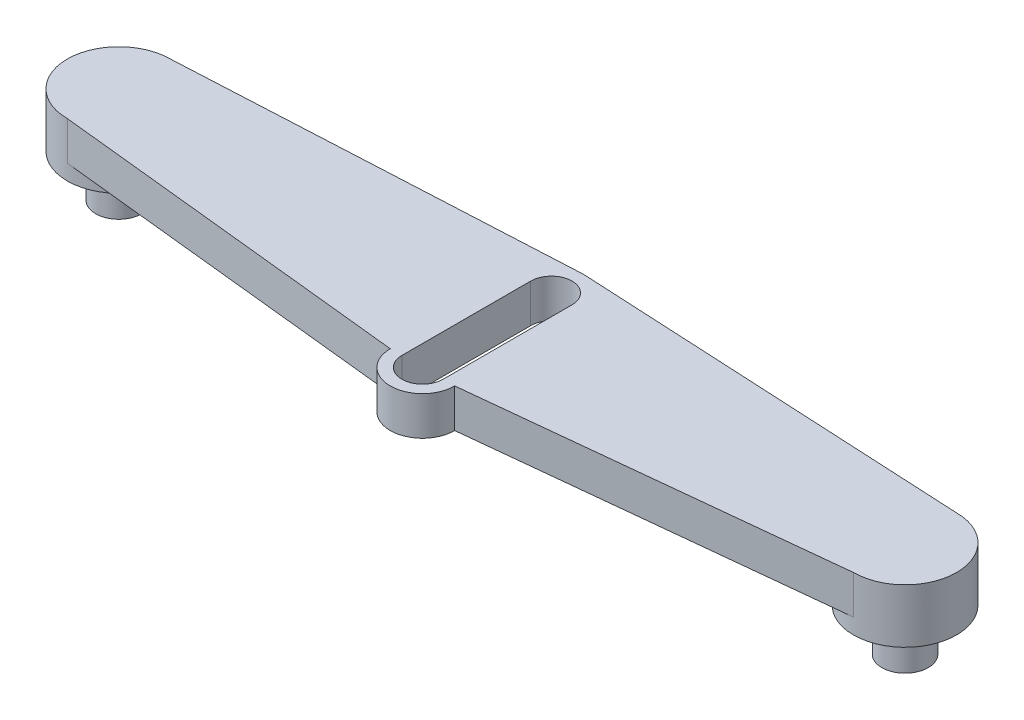
ISO-10303-21;
HEADER;
FILE_DESCRIPTION(('STEP AP214'),'2;1');
FILE_NAME('part.step','',(''),(''),'','','');
FILE_SCHEMA(('AUTOMOTIVE_DESIGN { 1 0 10303 214 1 1 1 1 }'));
ENDSEC;
DATA;
#1=APPLICATION_CONTEXT('core data for automotive mechanical design processes');
#2=APPLICATION_PROTOCOL_DEFINITION('international standard','automotive_design',2000,#1);
#3=PRODUCT_CONTEXT('',#1,'mechanical');
#4=PRODUCT('Part','Part','',(#3));
#5=PRODUCT_RELATED_PRODUCT_CATEGORY('part','',(#4));
#6=PRODUCT_DEFINITION_FORMATION('','',#4);
#7=PRODUCT_DEFINITION_CONTEXT('part definition',#1,'design');
#8=PRODUCT_DEFINITION('design','',#6,#7);
#9=PRODUCT_DEFINITION_SHAPE('','',#8);
#10=(LENGTH_UNIT() NAMED_UNIT(*) SI_UNIT(.MILLI.,.METRE.));
#11=(NAMED_UNIT(*) PLANE_ANGLE_UNIT() SI_UNIT($,.RADIAN.));
#12=(NAMED_UNIT(*) SI_UNIT($,.STERADIAN.) SOLID_ANGLE_UNIT());
#13=UNCERTAINTY_MEASURE_WITH_UNIT(LENGTH_MEASURE(1.E-05),#10,'distance_accuracy_value','');
#14=(GEOMETRIC_REPRESENTATION_CONTEXT(3) GLOBAL_UNCERTAINTY_ASSIGNED_CONTEXT((#13)) GLOBAL_UNIT_ASSIGNED_CONTEXT((#10,
#11,#12)) REPRESENTATION_CONTEXT('',''));
#15=CARTESIAN_POINT('',(0.,0.,0.));
#16=DIRECTION('',(0.,0.,1.));
#17=DIRECTION('',(1.,0.,0.));
#18=AXIS2_PLACEMENT_3D('',#15,#16,#17);
#19=CARTESIAN_POINT('',(0.,0.,0.));
#20=DIRECTION('',(0.,1.,0.));
#21=DIRECTION('',(0.,0.,1.));
#22=AXIS2_PLACEMENT_3D('',#19,#20,#21);
#23=PLANE('',#22);
#24=CARTESIAN_POINT('',(6.29937173741402,0.,11.8964997718201));
#25=DIRECTION('',(0.,1.,0.));
#26=DIRECTION('',(0.,0.,1.));
#27=AXIS2_PLACEMENT_3D('',#24,#25,#26);
#28=CIRCLE('',#27,1.79999999999999);
#29=CARTESIAN_POINT('',(6.29937173741402,0.,13.6964997718201));
#30=VERTEX_POINT('',#29);
#31=EDGE_CURVE('E348',#30,#30,#28,.T.);
#32=ORIENTED_EDGE('',*,*,#31,.T.);
#33=EDGE_LOOP('',(#32));
#34=FACE_BOUND('',#33,.T.);
#35=CARTESIAN_POINT('',(6.29937173741402,0.,11.8964997718201));
#36=DIRECTION('',(0.,1.,0.));
#37=DIRECTION('',(0.,0.,1.));
#38=AXIS2_PLACEMENT_3D('',#35,#36,#37);
#39=CIRCLE('',#38,1.99999999999999);
#40=CARTESIAN_POINT('',(6.29937173741402,0.,13.8964997718201));
#41=VERTEX_POINT('',#40);
#42=EDGE_CURVE('E198',#41,#41,#39,.T.);
#43=ORIENTED_EDGE('',*,*,#42,.F.);
#44=EDGE_LOOP('',(#43));
#45=FACE_BOUND('',#44,.T.);
#46=ADVANCED_FACE('F59',(#34,#45),#23,.F.);
#47=CARTESIAN_POINT('',(6.29937173741402,-4.5,11.8964997718201));
#48=DIRECTION('',(0.,1.,0.));
#49=DIRECTION('',(0.,0.,1.));
#50=AXIS2_PLACEMENT_3D('',#47,#48,#49);
#51=CYLINDRICAL_SURFACE('',#50,1.79999999999999);
#52=CARTESIAN_POINT('',(6.29937173741402,-4.5,11.8964997718201));
#53=DIRECTION('',(0.,1.,0.));
#54=DIRECTION('',(0.,0.,1.));
#55=AXIS2_PLACEMENT_3D('',#52,#53,#54);
#56=CIRCLE('',#55,1.79999999999999);
#57=CARTESIAN_POINT('',(6.29937173741402,-4.5,13.6964997718201));
#58=VERTEX_POINT('',#57);
#59=EDGE_CURVE('E217',#58,#58,#56,.T.);
#60=ORIENTED_EDGE('',*,*,#59,.T.);
#61=EDGE_LOOP('',(#60));
#62=FACE_BOUND('',#61,.T.);
#63=ORIENTED_EDGE('',*,*,#31,.F.);
#64=EDGE_LOOP('',(#63));
#65=FACE_BOUND('',#64,.T.);
#66=ADVANCED_FACE('F264',(#62,#65),#51,.T.);
#67=CARTESIAN_POINT('',(0.,-4.5,0.));
#68=DIRECTION('',(0.,1.,0.));
#69=DIRECTION('',(0.,0.,1.));
#70=AXIS2_PLACEMENT_3D('',#67,#68,#69);
#71=PLANE('',#70);
#72=ORIENTED_EDGE('',*,*,#59,.F.);
#73=EDGE_LOOP('',(#72));
#74=FACE_BOUND('',#73,.T.);
#75=ADVANCED_FACE('F270',(#74),#71,.F.);
#76=CARTESIAN_POINT('',(6.29937173741402,-1.2,11.8964997718201));
#77=DIRECTION('',(0.,1.,0.));
#78=DIRECTION('',(0.,0.,1.));
#79=AXIS2_PLACEMENT_3D('',#76,#77,#78);
#80=CYLINDRICAL_SURFACE('',#79,1.99999999999999);
#81=CARTESIAN_POINT('',(6.29937173741402,-1.2,11.8964997718201));
#82=DIRECTION('',(0.,1.,0.));
#83=DIRECTION('',(0.,0.,1.));
#84=AXIS2_PLACEMENT_3D('',#81,#82,#83);
#85=CIRCLE('',#84,1.99999999999999);
#86=CARTESIAN_POINT('',(6.29937173741402,-1.2,13.8964997718201));
#87=VERTEX_POINT('',#86);
#88=EDGE_CURVE('E335',#87,#87,#85,.T.);
#89=ORIENTED_EDGE('',*,*,#88,.F.);
#90=EDGE_LOOP('',(#89));
#91=FACE_BOUND('',#90,.T.);
#92=ORIENTED_EDGE('',*,*,#42,.T.);
#93=EDGE_LOOP('',(#92));
#94=FACE_BOUND('',#93,.T.);
#95=ADVANCED_FACE('F309',(#91,#94),#80,.F.);
#96=CARTESIAN_POINT('',(0.,-1.2,0.));
#97=DIRECTION('',(0.,1.,0.));
#98=DIRECTION('',(0.,0.,1.));
#99=AXIS2_PLACEMENT_3D('',#96,#97,#98);
#100=PLANE('',#99);
#101=ORIENTED_EDGE('',*,*,#88,.T.);
#102=EDGE_LOOP('',(#101));
#103=FACE_BOUND('',#102,.T.);
#104=CARTESIAN_POINT('',(6.29937173741402,-1.2,11.8964997718201));
#105=DIRECTION('',(0.,1.,0.));
#106=DIRECTION('',(0.,0.,1.));
#107=AXIS2_PLACEMENT_3D('',#104,#105,#106);
#108=CIRCLE('',#107,3.99867945611847);
#109=CARTESIAN_POINT('',(6.29937173741402,-1.2,15.8951792279385));
#110=VERTEX_POINT('',#109);
#111=EDGE_CURVE('E333',#110,#110,#108,.T.);
#112=ORIENTED_EDGE('',*,*,#111,.F.);
#113=EDGE_LOOP('',(#112));
#114=FACE_BOUND('',#113,.T.);
#115=ADVANCED_FACE('F306',(#103,#114),#100,.F.);
#116=CARTESIAN_POINT('',(38.399371737414,3.,0.));
#117=DIRECTION('',(-1.,0.,0.));
#118=DIRECTION('',(0.,0.,1.));
#119=AXIS2_PLACEMENT_3D('',#116,#117,#118);
#120=PLANE('',#119);
#121=DIRECTION('',(0.,0.,-1.));
#122=VECTOR('',#121,1.);
#123=CARTESIAN_POINT('',(38.399371737414,0.,0.));
#124=LINE('',#123,#122);
#125=CARTESIAN_POINT('',(38.399371737414,0.,18.8349533843524));
#126=VERTEX_POINT('',#125);
#127=CARTESIAN_POINT('',(38.399371737414,0.,8.8349533843524));
#128=VERTEX_POINT('',#127);
#129=EDGE_CURVE('E155',#126,#128,#124,.T.);
#130=ORIENTED_EDGE('',*,*,#129,.F.);
#131=DIRECTION('',(0.,-1.,0.));
#132=VECTOR('',#131,1.);
#133=CARTESIAN_POINT('',(38.399371737414,3.,18.8349533843524));
#134=LINE('',#133,#132);
#135=CARTESIAN_POINT('',(38.399371737414,3.,18.8349533843524));
#136=VERTEX_POINT('',#135);
#137=EDGE_CURVE('E150',#136,#126,#134,.T.);
#138=ORIENTED_EDGE('',*,*,#137,.F.);
#139=DIRECTION('',(0.,0.,-1.));
#140=VECTOR('',#139,1.);
#141=CARTESIAN_POINT('',(38.399371737414,3.,0.));
#142=LINE('',#141,#140);
#143=CARTESIAN_POINT('',(38.399371737414,3.,8.8349533843524));
#144=VERTEX_POINT('',#143);
#145=EDGE_CURVE('E153',#136,#144,#142,.T.);
#146=ORIENTED_EDGE('',*,*,#145,.T.);
#147=DIRECTION('',(0.,-1.,0.));
#148=VECTOR('',#147,1.);
#149=CARTESIAN_POINT('',(38.399371737414,3.,8.8349533843524));
#150=LINE('',#149,#148);
#151=EDGE_CURVE('E160',#144,#128,#150,.T.);
#152=ORIENTED_EDGE('',*,*,#151,.T.);
#153=EDGE_LOOP('',(#130,#138,#146,#152));
#154=FACE_BOUND('',#153,.T.);
#155=ADVANCED_FACE('F152',(#154),#120,.T.);
#156=CARTESIAN_POINT('',(36.799371737414,3.,18.8349533843524));
#157=DIRECTION('',(0.,-1.,0.));
#158=DIRECTION('',(0.,0.,-1.));
#159=AXIS2_PLACEMENT_3D('',#156,#157,#158);
#160=CYLINDRICAL_SURFACE('',#159,1.6);
#161=CARTESIAN_POINT('',(36.799371737414,0.,18.8349533843524));
#162=DIRECTION('',(0.,1.,0.));
#163=DIRECTION('',(0.,0.,1.));
#164=AXIS2_PLACEMENT_3D('',#161,#162,#163);
#165=CIRCLE('',#164,1.6);
#166=CARTESIAN_POINT('',(35.199371737414,0.,18.8349533843524));
#167=VERTEX_POINT('',#166);
#168=EDGE_CURVE('E190',#167,#126,#165,.T.);
#169=ORIENTED_EDGE('',*,*,#168,.F.);
#170=DIRECTION('',(0.,-1.,0.));
#171=VECTOR('',#170,1.);
#172=CARTESIAN_POINT('',(35.199371737414,3.,18.8349533843524));
#173=LINE('',#172,#171);
#174=CARTESIAN_POINT('',(35.199371737414,3.,18.8349533843524));
#175=VERTEX_POINT('',#174);
#176=EDGE_CURVE('E108',#175,#167,#173,.T.);
#177=ORIENTED_EDGE('',*,*,#176,.F.);
#178=CARTESIAN_POINT('',(36.799371737414,3.,18.8349533843524));
#179=DIRECTION('',(0.,1.,0.));
#180=DIRECTION('',(0.,0.,1.));
#181=AXIS2_PLACEMENT_3D('',#178,#179,#180);
#182=CIRCLE('',#181,1.6);
#183=EDGE_CURVE('E163',#175,#136,#182,.T.);
#184=ORIENTED_EDGE('',*,*,#183,.T.);
#185=ORIENTED_EDGE('',*,*,#137,.T.);
#186=EDGE_LOOP('',(#169,#177,#184,#185));
#187=FACE_BOUND('',#186,.T.);
#188=ADVANCED_FACE('F166',(#187),#160,.F.);
#189=CARTESIAN_POINT('',(35.199371737414,3.,0.));
#190=DIRECTION('',(-1.,0.,0.));
#191=DIRECTION('',(0.,0.,1.));
#192=AXIS2_PLACEMENT_3D('',#189,#190,#191);
#193=PLANE('',#192);
#194=DIRECTION('',(0.,0.,-1.));
#195=VECTOR('',#194,1.);
#196=CARTESIAN_POINT('',(35.199371737414,0.,0.));
#197=LINE('',#196,#195);
#198=CARTESIAN_POINT('',(35.199371737414,0.,8.8349533843524));
#199=VERTEX_POINT('',#198);
#200=EDGE_CURVE('E192',#167,#199,#197,.T.);
#201=ORIENTED_EDGE('',*,*,#200,.T.);
#202=DIRECTION('',(0.,-1.,0.));
#203=VECTOR('',#202,1.);
#204=CARTESIAN_POINT('',(35.199371737414,3.,8.8349533843524));
#205=LINE('',#204,#203);
#206=CARTESIAN_POINT('',(35.199371737414,3.,8.8349533843524));
#207=VERTEX_POINT('',#206);
#208=EDGE_CURVE('E115',#207,#199,#205,.T.);
#209=ORIENTED_EDGE('',*,*,#208,.F.);
#210=DIRECTION('',(0.,0.,-1.));
#211=VECTOR('',#210,1.);
#212=CARTESIAN_POINT('',(35.199371737414,3.,0.));
#213=LINE('',#212,#211);
#214=EDGE_CURVE('E76',#175,#207,#213,.T.);
#215=ORIENTED_EDGE('',*,*,#214,.F.);
#216=ORIENTED_EDGE('',*,*,#176,.T.);
#217=EDGE_LOOP('',(#201,#209,#215,#216));
#218=FACE_BOUND('',#217,.T.);
#219=ADVANCED_FACE('F252',(#218),#193,.F.);
#220=CARTESIAN_POINT('',(36.799371737414,3.,8.8349533843524));
#221=DIRECTION('',(0.,-1.,0.));
#222=DIRECTION('',(0.,0.,-1.));
#223=AXIS2_PLACEMENT_3D('',#220,#221,#222);
#224=CYLINDRICAL_SURFACE('',#223,1.6);
#225=CARTESIAN_POINT('',(36.799371737414,0.,8.8349533843524));
#226=DIRECTION('',(0.,1.,0.));
#227=DIRECTION('',(0.,0.,1.));
#228=AXIS2_PLACEMENT_3D('',#225,#226,#227);
#229=CIRCLE('',#228,1.6);
#230=EDGE_CURVE('E186',#128,#199,#229,.T.);
#231=ORIENTED_EDGE('',*,*,#230,.F.);
#232=ORIENTED_EDGE('',*,*,#151,.F.);
#233=CARTESIAN_POINT('',(36.799371737414,3.,8.8349533843524));
#234=DIRECTION('',(0.,1.,0.));
#235=DIRECTION('',(0.,0.,1.));
#236=AXIS2_PLACEMENT_3D('',#233,#234,#235);
#237=CIRCLE('',#236,1.6);
#238=EDGE_CURVE('E164',#144,#207,#237,.T.);
#239=ORIENTED_EDGE('',*,*,#238,.T.);
#240=ORIENTED_EDGE('',*,*,#208,.T.);
#241=EDGE_LOOP('',(#231,#232,#239,#240));
#242=FACE_BOUND('',#241,.T.);
#243=ADVANCED_FACE('F251',(#242),#224,.F.);
#244=CARTESIAN_POINT('',(36.799371737414,3.,18.8349533843524));
#245=DIRECTION('',(0.,-1.,0.));
#246=DIRECTION('',(0.,0.,-1.));
#247=AXIS2_PLACEMENT_3D('',#244,#245,#246);
#248=CYLINDRICAL_SURFACE('',#247,2.5);
#249=CARTESIAN_POINT('',(36.799371737414,0.,18.8349533843524));
#250=DIRECTION('',(0.,1.,0.));
#251=DIRECTION('',(0.,0.,1.));
#252=AXIS2_PLACEMENT_3D('',#249,#250,#251);
#253=CIRCLE('',#252,2.5);
#254=CARTESIAN_POINT('',(34.299371737414,0.,18.8349533843524));
#255=VERTEX_POINT('',#254);
#256=CARTESIAN_POINT('',(39.299371737414,0.,18.8349533843524));
#257=VERTEX_POINT('',#256);
#258=EDGE_CURVE('E174',#255,#257,#253,.T.);
#259=ORIENTED_EDGE('',*,*,#258,.T.);
#260=DIRECTION('',(0.,-1.,0.));
#261=VECTOR('',#260,1.);
#262=CARTESIAN_POINT('',(39.299371737414,3.,18.8349533843524));
#263=LINE('',#262,#261);
#264=CARTESIAN_POINT('',(39.299371737414,3.,18.8349533843524));
#265=VERTEX_POINT('',#264);
#266=EDGE_CURVE('E209',#265,#257,#263,.T.);
#267=ORIENTED_EDGE('',*,*,#266,.F.);
#268=CARTESIAN_POINT('',(36.799371737414,3.,18.8349533843524));
#269=DIRECTION('',(0.,1.,0.));
#270=DIRECTION('',(0.,0.,1.));
#271=AXIS2_PLACEMENT_3D('',#268,#269,#270);
#272=CIRCLE('',#271,2.5);
#273=CARTESIAN_POINT('',(34.299371737414,3.,18.8349533843524));
#274=VERTEX_POINT('',#273);
#275=EDGE_CURVE('E246',#274,#265,#272,.T.);
#276=ORIENTED_EDGE('',*,*,#275,.F.);
#277=DIRECTION('',(0.,-1.,0.));
#278=VECTOR('',#277,1.);
#279=CARTESIAN_POINT('',(34.299371737414,3.,18.8349533843524));
#280=LINE('',#279,#278);
#281=EDGE_CURVE('E212',#274,#255,#280,.T.);
#282=ORIENTED_EDGE('',*,*,#281,.T.);
#283=EDGE_LOOP('',(#259,#267,#276,#282));
#284=FACE_BOUND('',#283,.T.);
#285=ADVANCED_FACE('F259',(#284),#248,.T.);
#286=CARTESIAN_POINT('',(2.38054146025017,3.,22.7056546480289));
#287=DIRECTION('',(-0.104272029291522,0.,-0.994548814240622));
#288=DIRECTION('',(-0.994548814240622,0.,0.104272029291522));
#289=AXIS2_PLACEMENT_3D('',#286,#287,#288);
#290=PLANE('',#289);
#291=DIRECTION('',(0.994548814240622,0.,-0.104272029291522));
#292=VECTOR('',#291,1.);
#293=CARTESIAN_POINT('',(2.38054146025017,0.,22.7056546480289));
#294=LINE('',#293,#292);
#295=CARTESIAN_POINT('',(67.3023805011107,0.,15.8990185079045));
#296=VERTEX_POINT('',#295);
#297=EDGE_CURVE('E177',#257,#296,#294,.T.);
#298=ORIENTED_EDGE('',*,*,#297,.T.);
#299=DIRECTION('',(0.,-1.,0.));
#300=VECTOR('',#299,1.);
#301=CARTESIAN_POINT('',(67.3023805011107,3.,15.8990185079045));
#302=LINE('',#301,#300);
#303=CARTESIAN_POINT('',(67.3023805011107,3.,15.8990185079045));
#304=VERTEX_POINT('',#303);
#305=EDGE_CURVE('E206',#304,#296,#302,.T.);
#306=ORIENTED_EDGE('',*,*,#305,.F.);
#307=DIRECTION('',(0.994548814240622,0.,-0.104272029291522));
#308=VECTOR('',#307,1.);
#309=CARTESIAN_POINT('',(2.38054146025017,3.,22.7056546480289));
#310=LINE('',#309,#308);
#311=EDGE_CURVE('E242',#265,#304,#310,.T.);
#312=ORIENTED_EDGE('',*,*,#311,.F.);
#313=ORIENTED_EDGE('',*,*,#266,.T.);
#314=EDGE_LOOP('',(#298,#306,#312,#313));
#315=FACE_BOUND('',#314,.T.);
#316=ADVANCED_FACE('F231',(#315),#290,.F.);
#317=CARTESIAN_POINT('',(67.3023805011107,3.,11.8964997718005));
#318=DIRECTION('',(0.,-1.,0.));
#319=DIRECTION('',(0.,0.,-1.));
#320=AXIS2_PLACEMENT_3D('',#317,#318,#319);
#321=CYLINDRICAL_SURFACE('',#320,4.00251873610402);
#322=ORIENTED_EDGE('',*,*,#305,.T.);
#323=CARTESIAN_POINT('',(67.3023805011107,0.,11.8964997718005));
#324=DIRECTION('',(0.,1.,0.));
#325=DIRECTION('',(0.,0.,1.));
#326=AXIS2_PLACEMENT_3D('',#323,#324,#325);
#327=CIRCLE('',#326,4.00251873610402);
#328=CARTESIAN_POINT('',(67.3023805011107,0.,7.89398103569649));
#329=VERTEX_POINT('',#328);
#330=EDGE_CURVE('E68',#329,#296,#327,.T.);
#331=ORIENTED_EDGE('',*,*,#330,.F.);
#332=DIRECTION('',(0.,-1.,0.));
#333=VECTOR('',#332,1.);
#334=CARTESIAN_POINT('',(67.3023805011107,3.,7.89398103569649));
#335=LINE('',#334,#333);
#336=CARTESIAN_POINT('',(67.3023805011107,3.,7.89398103569649));
#337=VERTEX_POINT('',#336);
#338=EDGE_CURVE('E203',#337,#329,#335,.T.);
#339=ORIENTED_EDGE('',*,*,#338,.F.);
#340=CARTESIAN_POINT('',(67.3023805011107,3.,11.8964997718005));
#341=DIRECTION('',(0.,1.,0.));
#342=DIRECTION('',(0.,0.,1.));
#343=AXIS2_PLACEMENT_3D('',#340,#341,#342);
#344=CIRCLE('',#343,4.00251873610402);
#345=EDGE_CURVE('E237',#304,#337,#344,.T.);
#346=ORIENTED_EDGE('',*,*,#345,.F.);
#347=EDGE_LOOP('',(#322,#331,#339,#346));
#348=FACE_BOUND('',#347,.T.);
#349=CARTESIAN_POINT('',(67.3023805011107,-1.2,11.8964997718005));
#350=DIRECTION('',(0.,1.,0.));
#351=DIRECTION('',(0.,0.,1.));
#352=AXIS2_PLACEMENT_3D('',#349,#350,#351);
#353=CIRCLE('',#352,4.00251873610402);
#354=CARTESIAN_POINT('',(67.3023805011107,-1.2,15.8990185079045));
#355=VERTEX_POINT('',#354);
#356=EDGE_CURVE('E346',#355,#355,#353,.T.);
#357=ORIENTED_EDGE('',*,*,#356,.T.);
#358=EDGE_LOOP('',(#357));
#359=FACE_BOUND('',#358,.T.);
#360=ADVANCED_FACE('F235',(#348,#359),#321,.T.);
#361=CARTESIAN_POINT('',(-0.227059413315739,3.,4.44250957850469));
#362=DIRECTION('',(0.0510439912338768,0.,-0.998696405800539));
#363=DIRECTION('',(-0.99869640580054,0.,-0.0510439912338768));
#364=AXIS2_PLACEMENT_3D('',#361,#362,#363);
#365=PLANE('',#364);
#366=DIRECTION('',(0.99869640580054,0.,0.0510439912338768));
#367=VECTOR('',#366,1.);
#368=CARTESIAN_POINT('',(-0.227059413315739,0.,4.44250957850469));
#369=LINE('',#368,#367);
#370=CARTESIAN_POINT('',(36.799371737414,0.,6.33495338435239));
#371=VERTEX_POINT('',#370);
#372=EDGE_CURVE('E180',#371,#329,#369,.T.);
#373=ORIENTED_EDGE('',*,*,#372,.F.);
#374=DIRECTION('',(0.,-1.,0.));
#375=VECTOR('',#374,1.);
#376=CARTESIAN_POINT('',(36.799371737414,3.,6.33495338435239));
#377=LINE('',#376,#375);
#378=CARTESIAN_POINT('',(36.799371737414,3.,6.33495338435239));
#379=VERTEX_POINT('',#378);
#380=EDGE_CURVE('E201',#379,#371,#377,.T.);
#381=ORIENTED_EDGE('',*,*,#380,.F.);
#382=DIRECTION('',(0.99869640580054,0.,0.0510439912338768));
#383=VECTOR('',#382,1.);
#384=CARTESIAN_POINT('',(-0.227059413315739,3.,4.44250957850469));
#385=LINE('',#384,#383);
#386=EDGE_CURVE('E241',#379,#337,#385,.T.);
#387=ORIENTED_EDGE('',*,*,#386,.T.);
#388=ORIENTED_EDGE('',*,*,#338,.T.);
#389=EDGE_LOOP('',(#373,#381,#387,#388));
#390=FACE_BOUND('',#389,.T.);
#391=ADVANCED_FACE('F324',(#390),#365,.T.);
#392=CARTESIAN_POINT('',(0.420133553629365,3.,8.19908152681514));
#393=DIRECTION('',(-0.0511743985875462,0.,-0.998689732063569));
#394=DIRECTION('',(-0.998689732063569,0.,0.0511743985875462));
#395=AXIS2_PLACEMENT_3D('',#392,#393,#394);
#396=PLANE('',#395);
#397=DIRECTION('',(0.998689732063569,0.,-0.0511743985875463));
#398=VECTOR('',#397,1.);
#399=CARTESIAN_POINT('',(0.420133553629365,0.,8.19908152681514));
#400=LINE('',#399,#398);
#401=CARTESIAN_POINT('',(6.29937173741402,0.,7.89782031570161));
#402=VERTEX_POINT('',#401);
#403=EDGE_CURVE('E183',#402,#371,#400,.T.);
#404=ORIENTED_EDGE('',*,*,#403,.F.);
#405=DIRECTION('',(0.,-1.,0.));
#406=VECTOR('',#405,1.);
#407=CARTESIAN_POINT('',(6.29937173741402,3.,7.89782031570161));
#408=LINE('',#407,#406);
#409=CARTESIAN_POINT('',(6.29937173741402,3.,7.89782031570161));
#410=VERTEX_POINT('',#409);
#411=EDGE_CURVE('E168',#410,#402,#408,.T.);
#412=ORIENTED_EDGE('',*,*,#411,.F.);
#413=DIRECTION('',(0.998689732063569,0.,-0.0511743985875463));
#414=VECTOR('',#413,1.);
#415=CARTESIAN_POINT('',(0.420133553629365,3.,8.19908152681514));
#416=LINE('',#415,#414);
#417=EDGE_CURVE('E244',#410,#379,#416,.T.);
#418=ORIENTED_EDGE('',*,*,#417,.T.);
#419=ORIENTED_EDGE('',*,*,#380,.T.);
#420=EDGE_LOOP('',(#404,#412,#418,#419));
#421=FACE_BOUND('',#420,.T.);
#422=ADVANCED_FACE('F320',(#421),#396,.T.);
#423=CARTESIAN_POINT('',(0.,3.,0.));
#424=DIRECTION('',(0.,1.,0.));
#425=DIRECTION('',(0.,0.,1.));
#426=AXIS2_PLACEMENT_3D('',#423,#424,#425);
#427=PLANE('',#426);
#428=ORIENTED_EDGE('',*,*,#417,.F.);
#429=CARTESIAN_POINT('',(6.29937173741402,3.,11.8964997718201));
#430=DIRECTION('',(0.,1.,0.));
#431=DIRECTION('',(0.,0.,1.));
#432=AXIS2_PLACEMENT_3D('',#429,#430,#431);
#433=CIRCLE('',#432,3.99867945611847);
#434=CARTESIAN_POINT('',(6.29937173741402,3.,15.8951792279385));
#435=VERTEX_POINT('',#434);
#436=EDGE_CURVE('E175',#410,#435,#433,.T.);
#437=ORIENTED_EDGE('',*,*,#436,.T.);
#438=DIRECTION('',(0.99453349977195,0.,0.104417995725621));
#439=VECTOR('',#438,1.);
#440=CARTESIAN_POINT('',(-1.58198698020644,3.,15.0677001323854));
#441=LINE('',#440,#439);
#442=EDGE_CURVE('E194',#435,#274,#441,.T.);
#443=ORIENTED_EDGE('',*,*,#442,.T.);
#444=ORIENTED_EDGE('',*,*,#275,.T.);
#445=ORIENTED_EDGE('',*,*,#311,.T.);
#446=ORIENTED_EDGE('',*,*,#345,.T.);
#447=ORIENTED_EDGE('',*,*,#386,.F.);
#448=EDGE_LOOP('',(#428,#437,#443,#444,#445,#446,#447));
#449=FACE_BOUND('',#448,.T.);
#450=ORIENTED_EDGE('',*,*,#238,.F.);
#451=ORIENTED_EDGE('',*,*,#145,.F.);
#452=ORIENTED_EDGE('',*,*,#183,.F.);
#453=ORIENTED_EDGE('',*,*,#214,.T.);
#454=EDGE_LOOP('',(#450,#451,#452,#453));
#455=FACE_BOUND('',#454,.T.);
#456=ADVANCED_FACE('F162',(#449,#455),#427,.T.);
#457=ORIENTED_EDGE('',*,*,#372,.T.);
#458=ORIENTED_EDGE('',*,*,#330,.T.);
#459=ORIENTED_EDGE('',*,*,#297,.F.);
#460=ORIENTED_EDGE('',*,*,#258,.F.);
#461=DIRECTION('',(0.99453349977195,0.,0.104417995725621));
#462=VECTOR('',#461,1.);
#463=CARTESIAN_POINT('',(-1.58198698020644,0.,15.0677001323854));
#464=LINE('',#463,#462);
#465=CARTESIAN_POINT('',(6.29937173741402,0.,15.8951792279385));
#466=VERTEX_POINT('',#465);
#467=EDGE_CURVE('E172',#466,#255,#464,.T.);
#468=ORIENTED_EDGE('',*,*,#467,.F.);
#469=CARTESIAN_POINT('',(6.29937173741402,0.,11.8964997718201));
#470=DIRECTION('',(0.,1.,0.));
#471=DIRECTION('',(0.,0.,1.));
#472=AXIS2_PLACEMENT_3D('',#469,#470,#471);
#473=CIRCLE('',#472,3.99867945611847);
#474=EDGE_CURVE('E340',#466,#402,#473,.T.);
#475=ORIENTED_EDGE('',*,*,#474,.T.);
#476=ORIENTED_EDGE('',*,*,#403,.T.);
#477=EDGE_LOOP('',(#457,#458,#459,#460,#468,#475,#476));
#478=FACE_BOUND('',#477,.T.);
#479=ORIENTED_EDGE('',*,*,#230,.T.);
#480=ORIENTED_EDGE('',*,*,#200,.F.);
#481=ORIENTED_EDGE('',*,*,#168,.T.);
#482=ORIENTED_EDGE('',*,*,#129,.T.);
#483=EDGE_LOOP('',(#479,#480,#481,#482));
#484=FACE_BOUND('',#483,.T.);
#485=ADVANCED_FACE('F222',(#478,#484),#23,.F.);
#486=CARTESIAN_POINT('',(-1.58198698020644,3.,15.0677001323854));
#487=DIRECTION('',(0.104417995725621,0.,-0.99453349977195));
#488=DIRECTION('',(-0.99453349977195,0.,-0.104417995725621));
#489=AXIS2_PLACEMENT_3D('',#486,#487,#488);
#490=PLANE('',#489);
#491=ORIENTED_EDGE('',*,*,#467,.T.);
#492=ORIENTED_EDGE('',*,*,#281,.F.);
#493=ORIENTED_EDGE('',*,*,#442,.F.);
#494=DIRECTION('',(0.,-1.,0.));
#495=VECTOR('',#494,1.);
#496=CARTESIAN_POINT('',(6.29937173741402,3.,15.8951792279385));
#497=LINE('',#496,#495);
#498=EDGE_CURVE('E122',#435,#466,#497,.T.);
#499=ORIENTED_EDGE('',*,*,#498,.T.);
#500=EDGE_LOOP('',(#491,#492,#493,#499));
#501=FACE_BOUND('',#500,.T.);
#502=ADVANCED_FACE('F277',(#501),#490,.F.);
#503=CARTESIAN_POINT('',(6.29937173741402,3.,11.8964997718201));
#504=DIRECTION('',(0.,-1.,0.));
#505=DIRECTION('',(0.,0.,-1.));
#506=AXIS2_PLACEMENT_3D('',#503,#504,#505);
#507=CYLINDRICAL_SURFACE('',#506,3.99867945611847);
#508=ORIENTED_EDGE('',*,*,#411,.T.);
#509=ORIENTED_EDGE('',*,*,#474,.F.);
#510=ORIENTED_EDGE('',*,*,#498,.F.);
#511=ORIENTED_EDGE('',*,*,#436,.F.);
#512=EDGE_LOOP('',(#508,#509,#510,#511));
#513=FACE_BOUND('',#512,.T.);
#514=ORIENTED_EDGE('',*,*,#111,.T.);
#515=EDGE_LOOP('',(#514));
#516=FACE_BOUND('',#515,.T.);
#517=ADVANCED_FACE('F61',(#513,#516),#507,.T.);
#518=CARTESIAN_POINT('',(67.3023805011107,-1.2,11.8964997718005));
#519=DIRECTION('',(0.,1.,0.));
#520=DIRECTION('',(0.,0.,1.));
#521=AXIS2_PLACEMENT_3D('',#518,#519,#520);
#522=CYLINDRICAL_SURFACE('',#521,2.);
#523=CARTESIAN_POINT('',(67.3023805011107,-1.2,11.8964997718005));
#524=DIRECTION('',(0.,1.,0.));
#525=DIRECTION('',(0.,0.,1.));
#526=AXIS2_PLACEMENT_3D('',#523,#524,#525);
#527=CIRCLE('',#526,2.);
#528=CARTESIAN_POINT('',(67.3023805011107,-1.2,13.8964997718005));
#529=VERTEX_POINT('',#528);
#530=EDGE_CURVE('E546',#529,#529,#527,.T.);
#531=ORIENTED_EDGE('',*,*,#530,.F.);
#532=EDGE_LOOP('',(#531));
#533=FACE_BOUND('',#532,.T.);
#534=CARTESIAN_POINT('',(67.3023805011107,0.,11.8964997718005));
#535=DIRECTION('',(0.,1.,0.));
#536=DIRECTION('',(0.,0.,1.));
#537=AXIS2_PLACEMENT_3D('',#534,#535,#536);
#538=CIRCLE('',#537,2.);
#539=CARTESIAN_POINT('',(67.3023805011107,0.,13.8964997718005));
#540=VERTEX_POINT('',#539);
#541=EDGE_CURVE('E12',#540,#540,#538,.T.);
#542=ORIENTED_EDGE('',*,*,#541,.T.);
#543=EDGE_LOOP('',(#542));
#544=FACE_BOUND('',#543,.T.);
#545=ADVANCED_FACE('F293',(#533,#544),#522,.F.);
#546=CARTESIAN_POINT('',(0.,-1.2,0.));
#547=DIRECTION('',(0.,1.,0.));
#548=DIRECTION('',(0.,0.,1.));
#549=AXIS2_PLACEMENT_3D('',#546,#547,#548);
#550=PLANE('',#549);
#551=ORIENTED_EDGE('',*,*,#530,.T.);
#552=EDGE_LOOP('',(#551));
#553=FACE_BOUND('',#552,.T.);
#554=ORIENTED_EDGE('',*,*,#356,.F.);
#555=EDGE_LOOP('',(#554));
#556=FACE_BOUND('',#555,.T.);
#557=ADVANCED_FACE('F295',(#553,#556),#550,.F.);
#558=CARTESIAN_POINT('',(0.,-4.5,0.));
#559=DIRECTION('',(0.,1.,0.));
#560=DIRECTION('',(0.,0.,1.));
#561=AXIS2_PLACEMENT_3D('',#558,#559,#560);
#562=PLANE('',#561);
#563=CARTESIAN_POINT('',(67.3023805011107,-4.5,11.8964997718005));
#564=DIRECTION('',(0.,1.,0.));
#565=DIRECTION('',(0.,0.,1.));
#566=AXIS2_PLACEMENT_3D('',#563,#564,#565);
#567=CIRCLE('',#566,1.79999999999999);
#568=CARTESIAN_POINT('',(67.3023805011107,-4.5,13.6964997718005));
#569=VERTEX_POINT('',#568);
#570=EDGE_CURVE('E337',#569,#569,#567,.T.);
#571=ORIENTED_EDGE('',*,*,#570,.F.);
#572=EDGE_LOOP('',(#571));
#573=FACE_BOUND('',#572,.T.);
#574=ADVANCED_FACE('F284',(#573),#562,.F.);
#575=CARTESIAN_POINT('',(67.3023805011107,-4.5,11.8964997718005));
#576=DIRECTION('',(0.,1.,0.));
#577=DIRECTION('',(0.,0.,1.));
#578=AXIS2_PLACEMENT_3D('',#575,#576,#577);
#579=CYLINDRICAL_SURFACE('',#578,1.79999999999999);
#580=ORIENTED_EDGE('',*,*,#570,.T.);
#581=EDGE_LOOP('',(#580));
#582=FACE_BOUND('',#581,.T.);
#583=CARTESIAN_POINT('',(67.3023805011107,0.,11.8964997718005));
#584=DIRECTION('',(0.,1.,0.));
#585=DIRECTION('',(0.,0.,1.));
#586=AXIS2_PLACEMENT_3D('',#583,#584,#585);
#587=CIRCLE('',#586,1.79999999999999);
#588=CARTESIAN_POINT('',(67.3023805011107,0.,13.6964997718005));
#589=VERTEX_POINT('',#588);
#590=EDGE_CURVE('E290',#589,#589,#587,.T.);
#591=ORIENTED_EDGE('',*,*,#590,.F.);
#592=EDGE_LOOP('',(#591));
#593=FACE_BOUND('',#592,.T.);
#594=ADVANCED_FACE('F279',(#582,#593),#579,.T.);
#595=ORIENTED_EDGE('',*,*,#590,.T.);
#596=EDGE_LOOP('',(#595));
#597=FACE_BOUND('',#596,.T.);
#598=ORIENTED_EDGE('',*,*,#541,.F.);
#599=EDGE_LOOP('',(#598));
#600=FACE_BOUND('',#599,.T.);
#601=ADVANCED_FACE('F266',(#597,#600),#23,.F.);
#602=CLOSED_SHELL('',(#46,#66,#75,#95,#115,#155,#188,#219,#243,#285,#316,#360,#391,#422,#456,
#485,#502,#517,#545,#557,#574,#594,#601));
#603=MANIFOLD_SOLID_BREP('B2',#602);
#604=ADVANCED_BREP_SHAPE_REPRESENTATION('',(#18,#603),#14);
#605=SHAPE_DEFINITION_REPRESENTATION(#9,#604);
ENDSEC;
END-ISO-10303-21;
